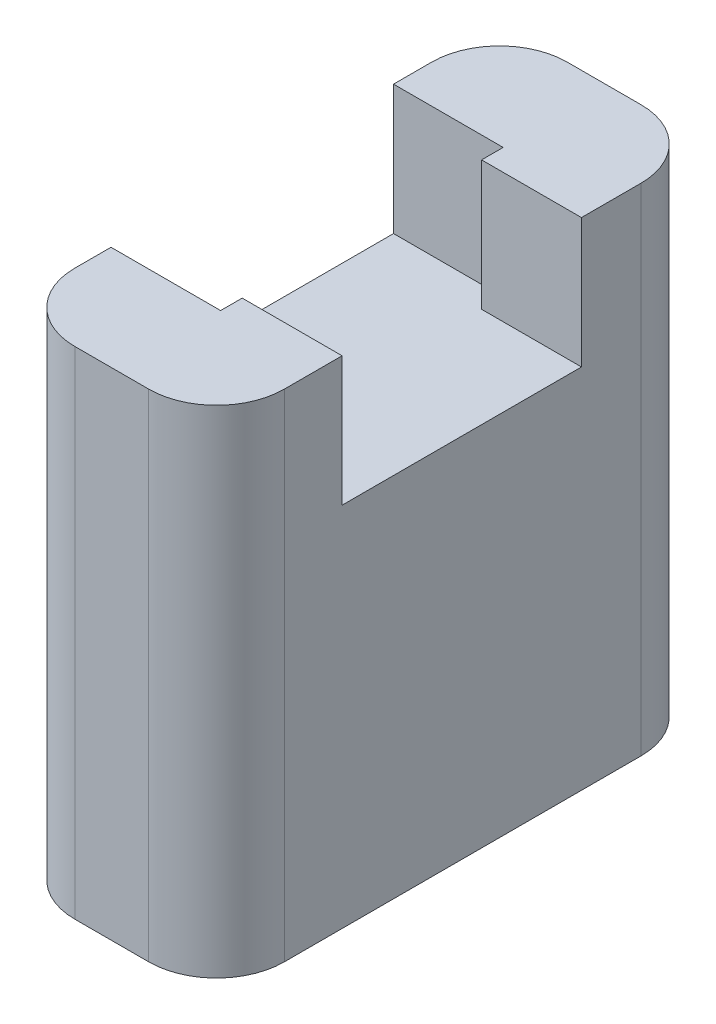
ISO-10303-21;
HEADER;
FILE_DESCRIPTION(('STEP AP214'),'2;1');
FILE_NAME('part.step','',(''),(''),'','','');
FILE_SCHEMA(('AUTOMOTIVE_DESIGN { 1 0 10303 214 1 1 1 1 }'));
ENDSEC;
DATA;
#1=APPLICATION_CONTEXT('core data for automotive mechanical design processes');
#2=APPLICATION_PROTOCOL_DEFINITION('international standard','automotive_design',2000,#1);
#3=PRODUCT_CONTEXT('',#1,'mechanical');
#4=PRODUCT('Part','Part','',(#3));
#5=PRODUCT_RELATED_PRODUCT_CATEGORY('part','',(#4));
#6=PRODUCT_DEFINITION_FORMATION('','',#4);
#7=PRODUCT_DEFINITION_CONTEXT('part definition',#1,'design');
#8=PRODUCT_DEFINITION('design','',#6,#7);
#9=PRODUCT_DEFINITION_SHAPE('','',#8);
#10=(LENGTH_UNIT() NAMED_UNIT(*) SI_UNIT(.MILLI.,.METRE.));
#11=(NAMED_UNIT(*) PLANE_ANGLE_UNIT() SI_UNIT($,.RADIAN.));
#12=(NAMED_UNIT(*) SI_UNIT($,.STERADIAN.) SOLID_ANGLE_UNIT());
#13=UNCERTAINTY_MEASURE_WITH_UNIT(LENGTH_MEASURE(1.E-05),#10,'distance_accuracy_value','');
#14=(GEOMETRIC_REPRESENTATION_CONTEXT(3) GLOBAL_UNCERTAINTY_ASSIGNED_CONTEXT((#13)) GLOBAL_UNIT_ASSIGNED_CONTEXT((#10,
#11,#12)) REPRESENTATION_CONTEXT('',''));
#15=CARTESIAN_POINT('',(0.,0.,0.));
#16=DIRECTION('',(0.,0.,1.));
#17=DIRECTION('',(1.,0.,0.));
#18=AXIS2_PLACEMENT_3D('',#15,#16,#17);
#19=CARTESIAN_POINT('',(38.1627437184587,3.,7.28290251343929));
#20=DIRECTION('',(0.,1.,0.));
#21=DIRECTION('',(0.,0.,1.));
#22=AXIS2_PLACEMENT_3D('',#19,#20,#21);
#23=PLANE('',#22);
#24=DIRECTION('',(1.,0.,0.));
#25=VECTOR('',#24,1.);
#26=CARTESIAN_POINT('',(0.,3.,12.8329025134393));
#27=LINE('',#26,#25);
#28=CARTESIAN_POINT('',(13.2204073400067,3.,12.8329025134393));
#29=VERTEX_POINT('',#28);
#30=CARTESIAN_POINT('',(17.8518941028648,3.,12.8329025134393));
#31=VERTEX_POINT('',#30);
#32=EDGE_CURVE('E192',#29,#31,#27,.T.);
#33=ORIENTED_EDGE('',*,*,#32,.T.);
#34=DIRECTION('',(0.,0.,-1.));
#35=VECTOR('',#34,1.);
#36=CARTESIAN_POINT('',(17.8518941028648,3.,-1.03641527504467));
#37=LINE('',#36,#35);
#38=CARTESIAN_POINT('',(17.8518941028648,3.,1.7329025134393));
#39=VERTEX_POINT('',#38);
#40=EDGE_CURVE('E280',#31,#39,#37,.T.);
#41=ORIENTED_EDGE('',*,*,#40,.T.);
#42=DIRECTION('',(1.,0.,0.));
#43=VECTOR('',#42,1.);
#44=CARTESIAN_POINT('',(0.,3.,1.7329025134393));
#45=LINE('',#44,#43);
#46=CARTESIAN_POINT('',(13.2204073400067,3.,1.7329025134393));
#47=VERTEX_POINT('',#46);
#48=EDGE_CURVE('E230',#47,#39,#45,.T.);
#49=ORIENTED_EDGE('',*,*,#48,.F.);
#50=DIRECTION('',(0.,0.,1.));
#51=VECTOR('',#50,1.);
#52=CARTESIAN_POINT('',(13.2204073400067,3.,0.));
#53=LINE('',#52,#51);
#54=CARTESIAN_POINT('',(13.2204073400067,3.,0.732902513439297));
#55=VERTEX_POINT('',#54);
#56=EDGE_CURVE('E249',#55,#47,#53,.T.);
#57=ORIENTED_EDGE('',*,*,#56,.F.);
#58=DIRECTION('',(1.,0.,0.));
#59=VECTOR('',#58,1.);
#60=CARTESIAN_POINT('',(0.,3.,0.732902513439297));
#61=LINE('',#60,#59);
#62=CARTESIAN_POINT('',(8.13760838857907,3.,0.732902513439297));
#63=VERTEX_POINT('',#62);
#64=EDGE_CURVE('E225',#63,#55,#61,.T.);
#65=ORIENTED_EDGE('',*,*,#64,.F.);
#66=DIRECTION('',(0.,0.,1.));
#67=VECTOR('',#66,1.);
#68=CARTESIAN_POINT('',(8.13760838857907,3.,15.5114739420107));
#69=LINE('',#68,#67);
#70=CARTESIAN_POINT('',(8.13760838857907,3.,13.8329025134393));
#71=VERTEX_POINT('',#70);
#72=EDGE_CURVE('E277',#63,#71,#69,.T.);
#73=ORIENTED_EDGE('',*,*,#72,.T.);
#74=DIRECTION('',(1.,0.,0.));
#75=VECTOR('',#74,1.);
#76=CARTESIAN_POINT('',(0.,3.,13.8329025134393));
#77=LINE('',#76,#75);
#78=CARTESIAN_POINT('',(13.2204073400067,3.,13.8329025134393));
#79=VERTEX_POINT('',#78);
#80=EDGE_CURVE('E59',#71,#79,#77,.T.);
#81=ORIENTED_EDGE('',*,*,#80,.T.);
#82=DIRECTION('',(0.,0.,1.));
#83=VECTOR('',#82,1.);
#84=CARTESIAN_POINT('',(13.2204073400067,3.,0.));
#85=LINE('',#84,#83);
#86=EDGE_CURVE('E54',#29,#79,#85,.T.);
#87=ORIENTED_EDGE('',*,*,#86,.F.);
#88=EDGE_LOOP('',(#33,#41,#49,#57,#65,#73,#81,#87));
#89=FACE_BOUND('',#88,.T.);
#90=ADVANCED_FACE('F37',(#89),#23,.T.);
#91=CARTESIAN_POINT('',(14.7090369600077,3.,-1.03641527504468));
#92=DIRECTION('',(0.,-1.,0.));
#93=DIRECTION('',(0.,0.,-1.));
#94=AXIS2_PLACEMENT_3D('',#91,#92,#93);
#95=CYLINDRICAL_SURFACE('',#94,3.14285714285715);
#96=DIRECTION('',(0.,-1.,0.));
#97=VECTOR('',#96,1.);
#98=CARTESIAN_POINT('',(17.8518941028648,3.,-1.03641527504467));
#99=LINE('',#98,#97);
#100=CARTESIAN_POINT('',(17.8518941028648,9.,-1.03641527504467));
#101=VERTEX_POINT('',#100);
#102=CARTESIAN_POINT('',(17.8518941028648,-14.,-1.03641527504467));
#103=VERTEX_POINT('',#102);
#104=EDGE_CURVE('E11',#101,#103,#99,.T.);
#105=ORIENTED_EDGE('',*,*,#104,.T.);
#106=CARTESIAN_POINT('',(14.7090369600077,-14.,-1.03641527504468));
#107=DIRECTION('',(0.,-1.,0.));
#108=DIRECTION('',(0.,0.,-1.));
#109=AXIS2_PLACEMENT_3D('',#106,#107,#108);
#110=CIRCLE('',#109,3.14285714285715);
#111=CARTESIAN_POINT('',(14.7090369600076,-14.,-4.17927241790183));
#112=VERTEX_POINT('',#111);
#113=EDGE_CURVE('E189',#112,#103,#110,.T.);
#114=ORIENTED_EDGE('',*,*,#113,.F.);
#115=DIRECTION('',(0.,-1.,0.));
#116=VECTOR('',#115,1.);
#117=CARTESIAN_POINT('',(14.7090369600076,3.,-4.17927241790183));
#118=LINE('',#117,#116);
#119=CARTESIAN_POINT('',(14.7090369600076,9.,-4.17927241790183));
#120=VERTEX_POINT('',#119);
#121=EDGE_CURVE('E46',#120,#112,#118,.T.);
#122=ORIENTED_EDGE('',*,*,#121,.F.);
#123=CARTESIAN_POINT('',(14.7090369600077,9.,-1.03641527504468));
#124=DIRECTION('',(0.,1.,0.));
#125=DIRECTION('',(0.,0.,1.));
#126=AXIS2_PLACEMENT_3D('',#123,#124,#125);
#127=CIRCLE('',#126,3.14285714285715);
#128=EDGE_CURVE('E237',#101,#120,#127,.T.);
#129=ORIENTED_EDGE('',*,*,#128,.F.);
#130=EDGE_LOOP('',(#105,#114,#122,#129));
#131=FACE_BOUND('',#130,.T.);
#132=ADVANCED_FACE('F39',(#131),#95,.T.);
#133=CARTESIAN_POINT('',(11.2804655314362,3.,-4.17927241790183));
#134=DIRECTION('',(0.,0.,1.));
#135=DIRECTION('',(1.,0.,0.));
#136=AXIS2_PLACEMENT_3D('',#133,#134,#135);
#137=PLANE('',#136);
#138=ORIENTED_EDGE('',*,*,#121,.T.);
#139=DIRECTION('',(1.,0.,0.));
#140=VECTOR('',#139,1.);
#141=CARTESIAN_POINT('',(14.7090369600076,-14.,-4.17927241790183));
#142=LINE('',#141,#140);
#143=CARTESIAN_POINT('',(11.2804655314362,-14.,-4.17927241790183));
#144=VERTEX_POINT('',#143);
#145=EDGE_CURVE('E186',#144,#112,#142,.T.);
#146=ORIENTED_EDGE('',*,*,#145,.F.);
#147=DIRECTION('',(0.,-1.,0.));
#148=VECTOR('',#147,1.);
#149=CARTESIAN_POINT('',(11.2804655314362,3.,-4.17927241790183));
#150=LINE('',#149,#148);
#151=CARTESIAN_POINT('',(11.2804655314362,9.,-4.17927241790183));
#152=VERTEX_POINT('',#151);
#153=EDGE_CURVE('E291',#152,#144,#150,.T.);
#154=ORIENTED_EDGE('',*,*,#153,.F.);
#155=DIRECTION('',(-1.,0.,0.));
#156=VECTOR('',#155,1.);
#157=CARTESIAN_POINT('',(0.,9.,-4.17927241790183));
#158=LINE('',#157,#156);
#159=EDGE_CURVE('E240',#120,#152,#158,.T.);
#160=ORIENTED_EDGE('',*,*,#159,.F.);
#161=EDGE_LOOP('',(#138,#146,#154,#160));
#162=FACE_BOUND('',#161,.T.);
#163=ADVANCED_FACE('F296',(#162),#137,.F.);
#164=CARTESIAN_POINT('',(11.2804655314362,3.,-1.03641527504468));
#165=DIRECTION('',(0.,-1.,0.));
#166=DIRECTION('',(0.,0.,-1.));
#167=AXIS2_PLACEMENT_3D('',#164,#165,#166);
#168=CYLINDRICAL_SURFACE('',#167,3.14285714285715);
#169=ORIENTED_EDGE('',*,*,#153,.T.);
#170=CARTESIAN_POINT('',(11.2804655314362,-14.,-1.03641527504468));
#171=DIRECTION('',(0.,-1.,0.));
#172=DIRECTION('',(0.,0.,-1.));
#173=AXIS2_PLACEMENT_3D('',#170,#171,#172);
#174=CIRCLE('',#173,3.14285714285715);
#175=CARTESIAN_POINT('',(8.13760838857907,-14.,-1.03641527504467));
#176=VERTEX_POINT('',#175);
#177=EDGE_CURVE('E183',#176,#144,#174,.T.);
#178=ORIENTED_EDGE('',*,*,#177,.F.);
#179=DIRECTION('',(0.,-1.,0.));
#180=VECTOR('',#179,1.);
#181=CARTESIAN_POINT('',(8.13760838857907,3.,-1.03641527504467));
#182=LINE('',#181,#180);
#183=CARTESIAN_POINT('',(8.13760838857907,9.,-1.03641527504467));
#184=VERTEX_POINT('',#183);
#185=EDGE_CURVE('E289',#184,#176,#182,.T.);
#186=ORIENTED_EDGE('',*,*,#185,.F.);
#187=CARTESIAN_POINT('',(11.2804655314362,9.,-1.03641527504468));
#188=DIRECTION('',(0.,1.,0.));
#189=DIRECTION('',(0.,0.,1.));
#190=AXIS2_PLACEMENT_3D('',#187,#188,#189);
#191=CIRCLE('',#190,3.14285714285715);
#192=EDGE_CURVE('E243',#152,#184,#191,.T.);
#193=ORIENTED_EDGE('',*,*,#192,.F.);
#194=EDGE_LOOP('',(#169,#178,#186,#193));
#195=FACE_BOUND('',#194,.T.);
#196=ADVANCED_FACE('F339',(#195),#168,.T.);
#197=CARTESIAN_POINT('',(8.13760838857907,3.,15.5114739420107));
#198=DIRECTION('',(1.,0.,0.));
#199=DIRECTION('',(0.,0.,-1.));
#200=AXIS2_PLACEMENT_3D('',#197,#198,#199);
#201=PLANE('',#200);
#202=ORIENTED_EDGE('',*,*,#185,.T.);
#203=DIRECTION('',(0.,0.,-1.));
#204=VECTOR('',#203,1.);
#205=CARTESIAN_POINT('',(8.13760838857907,-14.,-1.03641527504467));
#206=LINE('',#205,#204);
#207=CARTESIAN_POINT('',(8.13760838857907,-14.,15.5114739420107));
#208=VERTEX_POINT('',#207);
#209=EDGE_CURVE('E180',#208,#176,#206,.T.);
#210=ORIENTED_EDGE('',*,*,#209,.F.);
#211=DIRECTION('',(0.,-1.,0.));
#212=VECTOR('',#211,1.);
#213=CARTESIAN_POINT('',(8.13760838857907,3.,15.5114739420107));
#214=LINE('',#213,#212);
#215=CARTESIAN_POINT('',(8.13760838857907,9.,15.5114739420107));
#216=VERTEX_POINT('',#215);
#217=EDGE_CURVE('E287',#216,#208,#214,.T.);
#218=ORIENTED_EDGE('',*,*,#217,.F.);
#219=DIRECTION('',(0.,0.,1.));
#220=VECTOR('',#219,1.);
#221=CARTESIAN_POINT('',(8.13760838857907,9.,0.));
#222=LINE('',#221,#220);
#223=CARTESIAN_POINT('',(8.13760838857907,9.,13.8329025134393));
#224=VERTEX_POINT('',#223);
#225=EDGE_CURVE('E201',#224,#216,#222,.T.);
#226=ORIENTED_EDGE('',*,*,#225,.F.);
#227=DIRECTION('',(0.,-1.,0.));
#228=VECTOR('',#227,1.);
#229=CARTESIAN_POINT('',(8.13760838857907,9.,13.8329025134393));
#230=LINE('',#229,#228);
#231=EDGE_CURVE('E218',#224,#71,#230,.T.);
#232=ORIENTED_EDGE('',*,*,#231,.T.);
#233=ORIENTED_EDGE('',*,*,#72,.F.);
#234=DIRECTION('',(0.,-1.,0.));
#235=VECTOR('',#234,1.);
#236=CARTESIAN_POINT('',(8.13760838857907,9.,0.732902513439297));
#237=LINE('',#236,#235);
#238=CARTESIAN_POINT('',(8.13760838857907,9.,0.732902513439297));
#239=VERTEX_POINT('',#238);
#240=EDGE_CURVE('E248',#239,#63,#237,.T.);
#241=ORIENTED_EDGE('',*,*,#240,.F.);
#242=DIRECTION('',(0.,0.,1.));
#243=VECTOR('',#242,1.);
#244=CARTESIAN_POINT('',(8.13760838857907,9.,0.));
#245=LINE('',#244,#243);
#246=EDGE_CURVE('E246',#184,#239,#245,.T.);
#247=ORIENTED_EDGE('',*,*,#246,.F.);
#248=EDGE_LOOP('',(#202,#210,#218,#226,#232,#233,#241,#247));
#249=FACE_BOUND('',#248,.T.);
#250=ADVANCED_FACE('F315',(#249),#201,.F.);
#251=CARTESIAN_POINT('',(11.2804655314362,3.,15.5114739420107));
#252=DIRECTION('',(0.,-1.,0.));
#253=DIRECTION('',(0.,0.,-1.));
#254=AXIS2_PLACEMENT_3D('',#251,#252,#253);
#255=CYLINDRICAL_SURFACE('',#254,3.14285714285715);
#256=ORIENTED_EDGE('',*,*,#217,.T.);
#257=CARTESIAN_POINT('',(11.2804655314362,-14.,15.5114739420107));
#258=DIRECTION('',(0.,-1.,0.));
#259=DIRECTION('',(0.,0.,-1.));
#260=AXIS2_PLACEMENT_3D('',#257,#258,#259);
#261=CIRCLE('',#260,3.14285714285715);
#262=CARTESIAN_POINT('',(11.2804655314362,-14.,18.6543310848679));
#263=VERTEX_POINT('',#262);
#264=EDGE_CURVE('E170',#263,#208,#261,.T.);
#265=ORIENTED_EDGE('',*,*,#264,.F.);
#266=DIRECTION('',(0.,-1.,0.));
#267=VECTOR('',#266,1.);
#268=CARTESIAN_POINT('',(11.2804655314362,3.,18.6543310848679));
#269=LINE('',#268,#267);
#270=CARTESIAN_POINT('',(11.2804655314362,9.,18.6543310848679));
#271=VERTEX_POINT('',#270);
#272=EDGE_CURVE('E161',#271,#263,#269,.T.);
#273=ORIENTED_EDGE('',*,*,#272,.F.);
#274=CARTESIAN_POINT('',(11.2804655314362,9.,15.5114739420107));
#275=DIRECTION('',(0.,1.,0.));
#276=DIRECTION('',(0.,0.,1.));
#277=AXIS2_PLACEMENT_3D('',#274,#275,#276);
#278=CIRCLE('',#277,3.14285714285715);
#279=EDGE_CURVE('E204',#216,#271,#278,.T.);
#280=ORIENTED_EDGE('',*,*,#279,.F.);
#281=EDGE_LOOP('',(#256,#265,#273,#280));
#282=FACE_BOUND('',#281,.T.);
#283=ADVANCED_FACE('F335',(#282),#255,.T.);
#284=CARTESIAN_POINT('',(14.7090369600076,3.,18.6543310848679));
#285=DIRECTION('',(0.,0.,-1.));
#286=DIRECTION('',(-1.,0.,0.));
#287=AXIS2_PLACEMENT_3D('',#284,#285,#286);
#288=PLANE('',#287);
#289=ORIENTED_EDGE('',*,*,#272,.T.);
#290=DIRECTION('',(-1.,0.,0.));
#291=VECTOR('',#290,1.);
#292=CARTESIAN_POINT('',(11.2804655314362,-14.,18.6543310848679));
#293=LINE('',#292,#291);
#294=CARTESIAN_POINT('',(14.7090369600076,-14.,18.6543310848679));
#295=VERTEX_POINT('',#294);
#296=EDGE_CURVE('E165',#295,#263,#293,.T.);
#297=ORIENTED_EDGE('',*,*,#296,.F.);
#298=DIRECTION('',(0.,-1.,0.));
#299=VECTOR('',#298,1.);
#300=CARTESIAN_POINT('',(14.7090369600076,3.,18.6543310848679));
#301=LINE('',#300,#299);
#302=CARTESIAN_POINT('',(14.7090369600077,9.,18.6543310848679));
#303=VERTEX_POINT('',#302);
#304=EDGE_CURVE('E151',#303,#295,#301,.T.);
#305=ORIENTED_EDGE('',*,*,#304,.F.);
#306=DIRECTION('',(1.,0.,0.));
#307=VECTOR('',#306,1.);
#308=CARTESIAN_POINT('',(0.,9.,18.6543310848679));
#309=LINE('',#308,#307);
#310=EDGE_CURVE('E207',#271,#303,#309,.T.);
#311=ORIENTED_EDGE('',*,*,#310,.F.);
#312=EDGE_LOOP('',(#289,#297,#305,#311));
#313=FACE_BOUND('',#312,.T.);
#314=ADVANCED_FACE('F166',(#313),#288,.F.);
#315=CARTESIAN_POINT('',(14.7090369600077,3.,15.5114739420107));
#316=DIRECTION('',(0.,-1.,0.));
#317=DIRECTION('',(0.,0.,-1.));
#318=AXIS2_PLACEMENT_3D('',#315,#316,#317);
#319=CYLINDRICAL_SURFACE('',#318,3.14285714285715);
#320=ORIENTED_EDGE('',*,*,#304,.T.);
#321=CARTESIAN_POINT('',(14.7090369600077,-14.,15.5114739420107));
#322=DIRECTION('',(0.,-1.,0.));
#323=DIRECTION('',(0.,0.,-1.));
#324=AXIS2_PLACEMENT_3D('',#321,#322,#323);
#325=CIRCLE('',#324,3.14285714285715);
#326=CARTESIAN_POINT('',(17.8518941028648,-14.,15.5114739420107));
#327=VERTEX_POINT('',#326);
#328=EDGE_CURVE('E155',#327,#295,#325,.T.);
#329=ORIENTED_EDGE('',*,*,#328,.F.);
#330=DIRECTION('',(0.,-1.,0.));
#331=VECTOR('',#330,1.);
#332=CARTESIAN_POINT('',(17.8518941028648,3.,15.5114739420107));
#333=LINE('',#332,#331);
#334=CARTESIAN_POINT('',(17.8518941028648,9.,15.5114739420107));
#335=VERTEX_POINT('',#334);
#336=EDGE_CURVE('E162',#335,#327,#333,.T.);
#337=ORIENTED_EDGE('',*,*,#336,.F.);
#338=CARTESIAN_POINT('',(14.7090369600077,9.,15.5114739420107));
#339=DIRECTION('',(0.,1.,0.));
#340=DIRECTION('',(0.,0.,1.));
#341=AXIS2_PLACEMENT_3D('',#338,#339,#340);
#342=CIRCLE('',#341,3.14285714285715);
#343=EDGE_CURVE('E157',#303,#335,#342,.T.);
#344=ORIENTED_EDGE('',*,*,#343,.F.);
#345=EDGE_LOOP('',(#320,#329,#337,#344));
#346=FACE_BOUND('',#345,.T.);
#347=ADVANCED_FACE('F153',(#346),#319,.T.);
#348=CARTESIAN_POINT('',(17.8518941028648,3.,10.7686167991536));
#349=DIRECTION('',(-1.,0.,0.));
#350=DIRECTION('',(0.,0.,1.));
#351=AXIS2_PLACEMENT_3D('',#348,#349,#350);
#352=PLANE('',#351);
#353=ORIENTED_EDGE('',*,*,#336,.T.);
#354=DIRECTION('',(0.,0.,1.));
#355=VECTOR('',#354,1.);
#356=CARTESIAN_POINT('',(17.8518941028648,-14.,15.5114739420107));
#357=LINE('',#356,#355);
#358=EDGE_CURVE('E176',#103,#327,#357,.T.);
#359=ORIENTED_EDGE('',*,*,#358,.F.);
#360=ORIENTED_EDGE('',*,*,#104,.F.);
#361=DIRECTION('',(0.,0.,-1.));
#362=VECTOR('',#361,1.);
#363=CARTESIAN_POINT('',(17.8518941028648,9.,0.));
#364=LINE('',#363,#362);
#365=CARTESIAN_POINT('',(17.8518941028648,9.,1.7329025134393));
#366=VERTEX_POINT('',#365);
#367=EDGE_CURVE('E234',#366,#101,#364,.T.);
#368=ORIENTED_EDGE('',*,*,#367,.F.);
#369=DIRECTION('',(0.,-1.,0.));
#370=VECTOR('',#369,1.);
#371=CARTESIAN_POINT('',(17.8518941028648,9.,1.7329025134393));
#372=LINE('',#371,#370);
#373=EDGE_CURVE('E261',#366,#39,#372,.T.);
#374=ORIENTED_EDGE('',*,*,#373,.T.);
#375=ORIENTED_EDGE('',*,*,#40,.F.);
#376=DIRECTION('',(0.,-1.,0.));
#377=VECTOR('',#376,1.);
#378=CARTESIAN_POINT('',(17.8518941028648,9.,12.8329025134393));
#379=LINE('',#378,#377);
#380=CARTESIAN_POINT('',(17.8518941028648,9.,12.8329025134393));
#381=VERTEX_POINT('',#380);
#382=EDGE_CURVE('E212',#381,#31,#379,.T.);
#383=ORIENTED_EDGE('',*,*,#382,.F.);
#384=DIRECTION('',(0.,0.,-1.));
#385=VECTOR('',#384,1.);
#386=CARTESIAN_POINT('',(17.8518941028648,9.,0.));
#387=LINE('',#386,#385);
#388=EDGE_CURVE('E210',#335,#381,#387,.T.);
#389=ORIENTED_EDGE('',*,*,#388,.F.);
#390=EDGE_LOOP('',(#353,#359,#360,#368,#374,#375,#383,#389));
#391=FACE_BOUND('',#390,.T.);
#392=ADVANCED_FACE('F301',(#391),#352,.F.);
#393=CARTESIAN_POINT('',(0.,9.,0.732902513439297));
#394=DIRECTION('',(0.,0.,-1.));
#395=DIRECTION('',(-1.,0.,0.));
#396=AXIS2_PLACEMENT_3D('',#393,#394,#395);
#397=PLANE('',#396);
#398=ORIENTED_EDGE('',*,*,#64,.T.);
#399=DIRECTION('',(0.,-1.,0.));
#400=VECTOR('',#399,1.);
#401=CARTESIAN_POINT('',(13.2204073400067,9.,0.732902513439297));
#402=LINE('',#401,#400);
#403=CARTESIAN_POINT('',(13.2204073400067,9.,0.732902513439297));
#404=VERTEX_POINT('',#403);
#405=EDGE_CURVE('E267',#404,#55,#402,.T.);
#406=ORIENTED_EDGE('',*,*,#405,.F.);
#407=DIRECTION('',(1.,0.,0.));
#408=VECTOR('',#407,1.);
#409=CARTESIAN_POINT('',(0.,9.,0.732902513439297));
#410=LINE('',#409,#408);
#411=EDGE_CURVE('E226',#239,#404,#410,.T.);
#412=ORIENTED_EDGE('',*,*,#411,.F.);
#413=ORIENTED_EDGE('',*,*,#240,.T.);
#414=EDGE_LOOP('',(#398,#406,#412,#413));
#415=FACE_BOUND('',#414,.T.);
#416=ADVANCED_FACE('F312',(#415),#397,.F.);
#417=CARTESIAN_POINT('',(13.2204073400067,9.,0.));
#418=DIRECTION('',(1.,0.,0.));
#419=DIRECTION('',(0.,0.,-1.));
#420=AXIS2_PLACEMENT_3D('',#417,#418,#419);
#421=PLANE('',#420);
#422=ORIENTED_EDGE('',*,*,#56,.T.);
#423=DIRECTION('',(0.,-1.,0.));
#424=VECTOR('',#423,1.);
#425=CARTESIAN_POINT('',(13.2204073400067,9.,1.7329025134393));
#426=LINE('',#425,#424);
#427=CARTESIAN_POINT('',(13.2204073400067,9.,1.7329025134393));
#428=VERTEX_POINT('',#427);
#429=EDGE_CURVE('E254',#428,#47,#426,.T.);
#430=ORIENTED_EDGE('',*,*,#429,.F.);
#431=DIRECTION('',(0.,0.,1.));
#432=VECTOR('',#431,1.);
#433=CARTESIAN_POINT('',(13.2204073400067,9.,0.));
#434=LINE('',#433,#432);
#435=EDGE_CURVE('E229',#404,#428,#434,.T.);
#436=ORIENTED_EDGE('',*,*,#435,.F.);
#437=ORIENTED_EDGE('',*,*,#405,.T.);
#438=EDGE_LOOP('',(#422,#430,#436,#437));
#439=FACE_BOUND('',#438,.T.);
#440=ADVANCED_FACE('F310',(#439),#421,.F.);
#441=CARTESIAN_POINT('',(0.,9.,1.7329025134393));
#442=DIRECTION('',(0.,0.,-1.));
#443=DIRECTION('',(-1.,0.,0.));
#444=AXIS2_PLACEMENT_3D('',#441,#442,#443);
#445=PLANE('',#444);
#446=ORIENTED_EDGE('',*,*,#48,.T.);
#447=ORIENTED_EDGE('',*,*,#373,.F.);
#448=DIRECTION('',(1.,0.,0.));
#449=VECTOR('',#448,1.);
#450=CARTESIAN_POINT('',(0.,9.,1.7329025134393));
#451=LINE('',#450,#449);
#452=EDGE_CURVE('E232',#428,#366,#451,.T.);
#453=ORIENTED_EDGE('',*,*,#452,.F.);
#454=ORIENTED_EDGE('',*,*,#429,.T.);
#455=EDGE_LOOP('',(#446,#447,#453,#454));
#456=FACE_BOUND('',#455,.T.);
#457=ADVANCED_FACE('F307',(#456),#445,.F.);
#458=CARTESIAN_POINT('',(0.,9.,0.));
#459=DIRECTION('',(0.,1.,0.));
#460=DIRECTION('',(0.,0.,1.));
#461=AXIS2_PLACEMENT_3D('',#458,#459,#460);
#462=PLANE('',#461);
#463=ORIENTED_EDGE('',*,*,#411,.T.);
#464=ORIENTED_EDGE('',*,*,#435,.T.);
#465=ORIENTED_EDGE('',*,*,#452,.T.);
#466=ORIENTED_EDGE('',*,*,#367,.T.);
#467=ORIENTED_EDGE('',*,*,#128,.T.);
#468=ORIENTED_EDGE('',*,*,#159,.T.);
#469=ORIENTED_EDGE('',*,*,#192,.T.);
#470=ORIENTED_EDGE('',*,*,#246,.T.);
#471=EDGE_LOOP('',(#463,#464,#465,#466,#467,#468,#469,#470));
#472=FACE_BOUND('',#471,.T.);
#473=ADVANCED_FACE('F303',(#472),#462,.T.);
#474=CARTESIAN_POINT('',(0.,9.,12.8329025134393));
#475=DIRECTION('',(0.,0.,-1.));
#476=DIRECTION('',(-1.,0.,0.));
#477=AXIS2_PLACEMENT_3D('',#474,#475,#476);
#478=PLANE('',#477);
#479=ORIENTED_EDGE('',*,*,#32,.F.);
#480=DIRECTION('',(0.,-1.,0.));
#481=VECTOR('',#480,1.);
#482=CARTESIAN_POINT('',(13.2204073400067,9.,12.8329025134393));
#483=LINE('',#482,#481);
#484=CARTESIAN_POINT('',(13.2204073400067,9.,12.8329025134393));
#485=VERTEX_POINT('',#484);
#486=EDGE_CURVE('E223',#485,#29,#483,.T.);
#487=ORIENTED_EDGE('',*,*,#486,.F.);
#488=DIRECTION('',(1.,0.,0.));
#489=VECTOR('',#488,1.);
#490=CARTESIAN_POINT('',(0.,9.,12.8329025134393));
#491=LINE('',#490,#489);
#492=EDGE_CURVE('E193',#485,#381,#491,.T.);
#493=ORIENTED_EDGE('',*,*,#492,.T.);
#494=ORIENTED_EDGE('',*,*,#382,.T.);
#495=EDGE_LOOP('',(#479,#487,#493,#494));
#496=FACE_BOUND('',#495,.T.);
#497=ADVANCED_FACE('F328',(#496),#478,.T.);
#498=CARTESIAN_POINT('',(13.2204073400067,9.,0.));
#499=DIRECTION('',(1.,0.,0.));
#500=DIRECTION('',(0.,0.,-1.));
#501=AXIS2_PLACEMENT_3D('',#498,#499,#500);
#502=PLANE('',#501);
#503=ORIENTED_EDGE('',*,*,#86,.T.);
#504=DIRECTION('',(0.,-1.,0.));
#505=VECTOR('',#504,1.);
#506=CARTESIAN_POINT('',(13.2204073400067,9.,13.8329025134393));
#507=LINE('',#506,#505);
#508=CARTESIAN_POINT('',(13.2204073400067,9.,13.8329025134393));
#509=VERTEX_POINT('',#508);
#510=EDGE_CURVE('E221',#509,#79,#507,.T.);
#511=ORIENTED_EDGE('',*,*,#510,.F.);
#512=DIRECTION('',(0.,0.,1.));
#513=VECTOR('',#512,1.);
#514=CARTESIAN_POINT('',(13.2204073400067,9.,0.));
#515=LINE('',#514,#513);
#516=EDGE_CURVE('E196',#485,#509,#515,.T.);
#517=ORIENTED_EDGE('',*,*,#516,.F.);
#518=ORIENTED_EDGE('',*,*,#486,.T.);
#519=EDGE_LOOP('',(#503,#511,#517,#518));
#520=FACE_BOUND('',#519,.T.);
#521=ADVANCED_FACE('F324',(#520),#502,.F.);
#522=CARTESIAN_POINT('',(0.,9.,13.8329025134393));
#523=DIRECTION('',(0.,0.,-1.));
#524=DIRECTION('',(-1.,0.,0.));
#525=AXIS2_PLACEMENT_3D('',#522,#523,#524);
#526=PLANE('',#525);
#527=ORIENTED_EDGE('',*,*,#80,.F.);
#528=ORIENTED_EDGE('',*,*,#231,.F.);
#529=DIRECTION('',(1.,0.,0.));
#530=VECTOR('',#529,1.);
#531=CARTESIAN_POINT('',(0.,9.,13.8329025134393));
#532=LINE('',#531,#530);
#533=EDGE_CURVE('E198',#224,#509,#532,.T.);
#534=ORIENTED_EDGE('',*,*,#533,.T.);
#535=ORIENTED_EDGE('',*,*,#510,.T.);
#536=EDGE_LOOP('',(#527,#528,#534,#535));
#537=FACE_BOUND('',#536,.T.);
#538=ADVANCED_FACE('F320',(#537),#526,.T.);
#539=CARTESIAN_POINT('',(0.,9.,0.));
#540=DIRECTION('',(0.,1.,0.));
#541=DIRECTION('',(0.,0.,1.));
#542=AXIS2_PLACEMENT_3D('',#539,#540,#541);
#543=PLANE('',#542);
#544=ORIENTED_EDGE('',*,*,#492,.F.);
#545=ORIENTED_EDGE('',*,*,#516,.T.);
#546=ORIENTED_EDGE('',*,*,#533,.F.);
#547=ORIENTED_EDGE('',*,*,#225,.T.);
#548=ORIENTED_EDGE('',*,*,#279,.T.);
#549=ORIENTED_EDGE('',*,*,#310,.T.);
#550=ORIENTED_EDGE('',*,*,#343,.T.);
#551=ORIENTED_EDGE('',*,*,#388,.T.);
#552=EDGE_LOOP('',(#544,#545,#546,#547,#548,#549,#550,#551));
#553=FACE_BOUND('',#552,.T.);
#554=ADVANCED_FACE('F332',(#553),#543,.T.);
#555=CARTESIAN_POINT('',(14.7090369600077,-14.,15.5114739420107));
#556=DIRECTION('',(0.,-1.,0.));
#557=DIRECTION('',(0.,0.,-1.));
#558=AXIS2_PLACEMENT_3D('',#555,#556,#557);
#559=PLANE('',#558);
#560=ORIENTED_EDGE('',*,*,#328,.T.);
#561=ORIENTED_EDGE('',*,*,#296,.T.);
#562=ORIENTED_EDGE('',*,*,#264,.T.);
#563=ORIENTED_EDGE('',*,*,#209,.T.);
#564=ORIENTED_EDGE('',*,*,#177,.T.);
#565=ORIENTED_EDGE('',*,*,#145,.T.);
#566=ORIENTED_EDGE('',*,*,#113,.T.);
#567=ORIENTED_EDGE('',*,*,#358,.T.);
#568=EDGE_LOOP('',(#560,#561,#562,#563,#564,#565,#566,#567));
#569=FACE_BOUND('',#568,.T.);
#570=ADVANCED_FACE('F173',(#569),#559,.T.);
#571=CLOSED_SHELL('',(#90,#132,#163,#196,#250,#283,#314,#347,#392,#416,#440,#457,#473,#497,#521,
#538,#554,#570));
#572=MANIFOLD_SOLID_BREP('B2',#571);
#573=ADVANCED_BREP_SHAPE_REPRESENTATION('',(#18,#572),#14);
#574=SHAPE_DEFINITION_REPRESENTATION(#9,#573);
ENDSEC;
END-ISO-10303-21;
